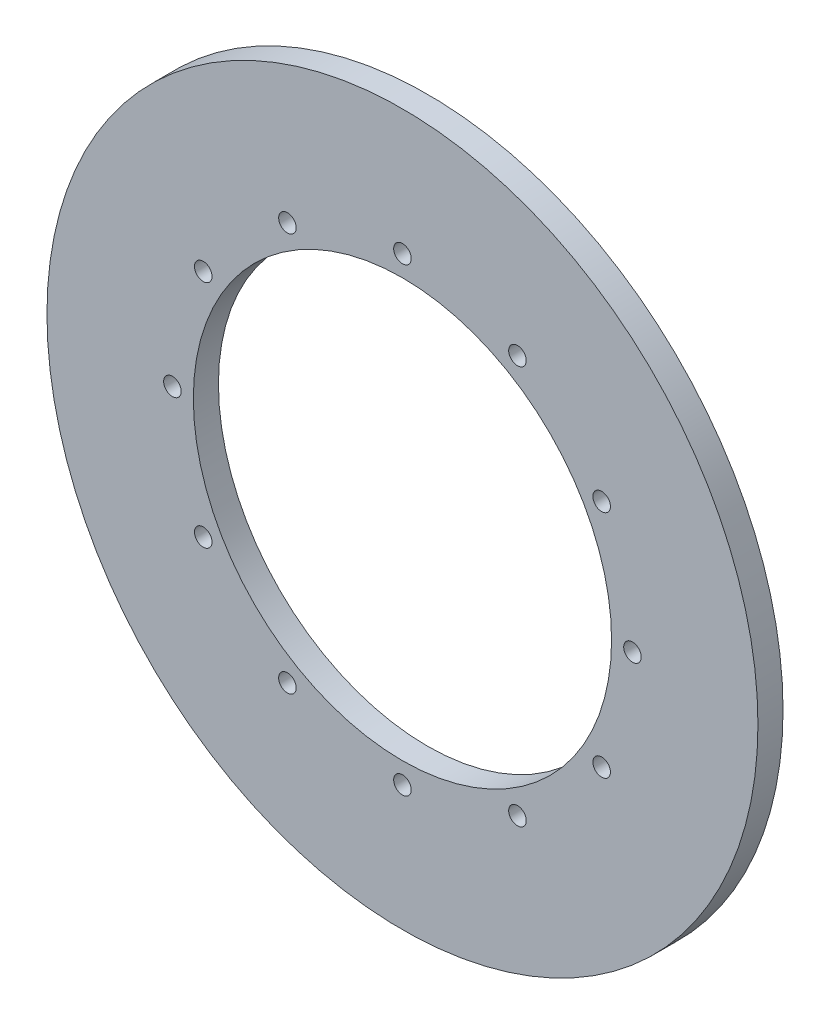
ISO-10303-21;
HEADER;
FILE_DESCRIPTION(('STEP AP214'),'2;1');
FILE_NAME('part.step','',(''),(''),'','','');
FILE_SCHEMA(('AUTOMOTIVE_DESIGN { 1 0 10303 214 1 1 1 1 }'));
ENDSEC;
DATA;
#1=APPLICATION_CONTEXT('core data for automotive mechanical design processes');
#2=APPLICATION_PROTOCOL_DEFINITION('international standard','automotive_design',2000,#1);
#3=PRODUCT_CONTEXT('',#1,'mechanical');
#4=PRODUCT('Part','Part','',(#3));
#5=PRODUCT_RELATED_PRODUCT_CATEGORY('part','',(#4));
#6=PRODUCT_DEFINITION_FORMATION('','',#4);
#7=PRODUCT_DEFINITION_CONTEXT('part definition',#1,'design');
#8=PRODUCT_DEFINITION('design','',#6,#7);
#9=PRODUCT_DEFINITION_SHAPE('','',#8);
#10=(LENGTH_UNIT() NAMED_UNIT(*) SI_UNIT(.MILLI.,.METRE.));
#11=(NAMED_UNIT(*) PLANE_ANGLE_UNIT() SI_UNIT($,.RADIAN.));
#12=(NAMED_UNIT(*) SI_UNIT($,.STERADIAN.) SOLID_ANGLE_UNIT());
#13=UNCERTAINTY_MEASURE_WITH_UNIT(LENGTH_MEASURE(1.E-05),#10,'distance_accuracy_value','');
#14=(GEOMETRIC_REPRESENTATION_CONTEXT(3) GLOBAL_UNCERTAINTY_ASSIGNED_CONTEXT((#13)) GLOBAL_UNIT_ASSIGNED_CONTEXT((#10,
#11,#12)) REPRESENTATION_CONTEXT('',''));
#15=CARTESIAN_POINT('',(0.,0.,0.));
#16=DIRECTION('',(0.,0.,1.));
#17=DIRECTION('',(1.,0.,0.));
#18=AXIS2_PLACEMENT_3D('',#15,#16,#17);
#19=CARTESIAN_POINT('',(-47.631397208143,27.4999999999979,3.));
#20=DIRECTION('',(0.,0.,-1.));
#21=DIRECTION('',(-1.,0.,0.));
#22=AXIS2_PLACEMENT_3D('',#19,#20,#21);
#23=CYLINDRICAL_SURFACE('',#22,2.10000000000236);
#24=CARTESIAN_POINT('',(-47.631397208143,27.4999999999979,3.));
#25=DIRECTION('',(0.,0.,-1.));
#26=DIRECTION('',(-1.,0.,0.));
#27=AXIS2_PLACEMENT_3D('',#24,#25,#26);
#28=CIRCLE('',#27,2.10000000000236);
#29=CARTESIAN_POINT('',(-49.7313972081453,27.4999999999979,3.));
#30=VERTEX_POINT('',#29);
#31=EDGE_CURVE('E38',#30,#30,#28,.T.);
#32=ORIENTED_EDGE('',*,*,#31,.F.);
#33=EDGE_LOOP('',(#32));
#34=FACE_BOUND('',#33,.T.);
#35=CARTESIAN_POINT('',(-47.631397208143,27.4999999999979,-3.));
#36=DIRECTION('',(0.,0.,-1.));
#37=DIRECTION('',(-1.,0.,0.));
#38=AXIS2_PLACEMENT_3D('',#35,#36,#37);
#39=CIRCLE('',#38,2.10000000000236);
#40=CARTESIAN_POINT('',(-49.7313972081453,27.4999999999979,-3.));
#41=VERTEX_POINT('',#40);
#42=EDGE_CURVE('E111',#41,#41,#39,.T.);
#43=ORIENTED_EDGE('',*,*,#42,.T.);
#44=EDGE_LOOP('',(#43));
#45=FACE_BOUND('',#44,.T.);
#46=ADVANCED_FACE('F35',(#34,#45),#23,.F.);
#47=CARTESIAN_POINT('',(-47.6313972081406,-27.500000000002,3.));
#48=DIRECTION('',(0.,0.,-1.));
#49=DIRECTION('',(-1.,0.,0.));
#50=AXIS2_PLACEMENT_3D('',#47,#48,#49);
#51=CYLINDRICAL_SURFACE('',#50,2.10000000000444);
#52=CARTESIAN_POINT('',(-47.6313972081406,-27.500000000002,3.));
#53=DIRECTION('',(0.,0.,-1.));
#54=DIRECTION('',(-1.,0.,0.));
#55=AXIS2_PLACEMENT_3D('',#52,#53,#54);
#56=CIRCLE('',#55,2.10000000000444);
#57=CARTESIAN_POINT('',(-49.7313972081451,-27.500000000002,3.));
#58=VERTEX_POINT('',#57);
#59=EDGE_CURVE('E95',#58,#58,#56,.T.);
#60=ORIENTED_EDGE('',*,*,#59,.F.);
#61=EDGE_LOOP('',(#60));
#62=FACE_BOUND('',#61,.T.);
#63=CARTESIAN_POINT('',(-47.6313972081406,-27.500000000002,-3.));
#64=DIRECTION('',(0.,0.,-1.));
#65=DIRECTION('',(-1.,0.,0.));
#66=AXIS2_PLACEMENT_3D('',#63,#64,#65);
#67=CIRCLE('',#66,2.10000000000444);
#68=CARTESIAN_POINT('',(-49.7313972081451,-27.500000000002,-3.));
#69=VERTEX_POINT('',#68);
#70=EDGE_CURVE('E120',#69,#69,#67,.T.);
#71=ORIENTED_EDGE('',*,*,#70,.T.);
#72=EDGE_LOOP('',(#71));
#73=FACE_BOUND('',#72,.T.);
#74=ADVANCED_FACE('F166',(#62,#73),#51,.F.);
#75=CARTESIAN_POINT('',(4.66937538383073E-12,-55.,3.));
#76=DIRECTION('',(0.,0.,-1.));
#77=DIRECTION('',(-1.,0.,0.));
#78=AXIS2_PLACEMENT_3D('',#75,#76,#77);
#79=CYLINDRICAL_SURFACE('',#78,2.10000000000483);
#80=CARTESIAN_POINT('',(4.66937538383073E-12,-55.,3.));
#81=DIRECTION('',(0.,0.,-1.));
#82=DIRECTION('',(-1.,0.,0.));
#83=AXIS2_PLACEMENT_3D('',#80,#81,#82);
#84=CIRCLE('',#83,2.10000000000483);
#85=CARTESIAN_POINT('',(-2.10000000000016,-55.,3.));
#86=VERTEX_POINT('',#85);
#87=EDGE_CURVE('E92',#86,#86,#84,.T.);
#88=ORIENTED_EDGE('',*,*,#87,.F.);
#89=EDGE_LOOP('',(#88));
#90=FACE_BOUND('',#89,.T.);
#91=CARTESIAN_POINT('',(4.66937538383073E-12,-55.,-3.));
#92=DIRECTION('',(0.,0.,-1.));
#93=DIRECTION('',(-1.,0.,0.));
#94=AXIS2_PLACEMENT_3D('',#91,#92,#93);
#95=CIRCLE('',#94,2.10000000000483);
#96=CARTESIAN_POINT('',(-2.10000000000016,-55.,-3.));
#97=VERTEX_POINT('',#96);
#98=EDGE_CURVE('E126',#97,#97,#95,.T.);
#99=ORIENTED_EDGE('',*,*,#98,.T.);
#100=EDGE_LOOP('',(#99));
#101=FACE_BOUND('',#100,.T.);
#102=ADVANCED_FACE('F171',(#90,#101),#79,.F.);
#103=CARTESIAN_POINT('',(47.6313972081476,-27.499999999998,3.));
#104=DIRECTION('',(0.,0.,-1.));
#105=DIRECTION('',(-1.,0.,0.));
#106=AXIS2_PLACEMENT_3D('',#103,#104,#105);
#107=CYLINDRICAL_SURFACE('',#106,2.10000000000301);
#108=CARTESIAN_POINT('',(47.6313972081476,-27.499999999998,3.));
#109=DIRECTION('',(0.,0.,-1.));
#110=DIRECTION('',(-1.,0.,0.));
#111=AXIS2_PLACEMENT_3D('',#108,#109,#110);
#112=CIRCLE('',#111,2.10000000000301);
#113=CARTESIAN_POINT('',(45.5313972081446,-27.499999999998,3.));
#114=VERTEX_POINT('',#113);
#115=EDGE_CURVE('E88',#114,#114,#112,.T.);
#116=ORIENTED_EDGE('',*,*,#115,.F.);
#117=EDGE_LOOP('',(#116));
#118=FACE_BOUND('',#117,.T.);
#119=CARTESIAN_POINT('',(47.6313972081476,-27.499999999998,-3.));
#120=DIRECTION('',(0.,0.,-1.));
#121=DIRECTION('',(-1.,0.,0.));
#122=AXIS2_PLACEMENT_3D('',#119,#120,#121);
#123=CIRCLE('',#122,2.10000000000301);
#124=CARTESIAN_POINT('',(45.5313972081446,-27.499999999998,-3.));
#125=VERTEX_POINT('',#124);
#126=EDGE_CURVE('E132',#125,#125,#123,.T.);
#127=ORIENTED_EDGE('',*,*,#126,.T.);
#128=EDGE_LOOP('',(#127));
#129=FACE_BOUND('',#128,.T.);
#130=ADVANCED_FACE('F216',(#118,#129),#107,.F.);
#131=CARTESIAN_POINT('',(47.6313972081453,27.500000000002,3.));
#132=DIRECTION('',(0.,0.,-1.));
#133=DIRECTION('',(-1.,0.,0.));
#134=AXIS2_PLACEMENT_3D('',#131,#132,#133);
#135=CYLINDRICAL_SURFACE('',#134,2.10000000000064);
#136=CARTESIAN_POINT('',(47.6313972081453,27.500000000002,3.));
#137=DIRECTION('',(0.,0.,-1.));
#138=DIRECTION('',(-1.,0.,0.));
#139=AXIS2_PLACEMENT_3D('',#136,#137,#138);
#140=CIRCLE('',#139,2.10000000000064);
#141=CARTESIAN_POINT('',(45.5313972081447,27.500000000002,3.));
#142=VERTEX_POINT('',#141);
#143=EDGE_CURVE('E84',#142,#142,#140,.T.);
#144=ORIENTED_EDGE('',*,*,#143,.F.);
#145=EDGE_LOOP('',(#144));
#146=FACE_BOUND('',#145,.T.);
#147=CARTESIAN_POINT('',(47.6313972081453,27.500000000002,-3.));
#148=DIRECTION('',(0.,0.,-1.));
#149=DIRECTION('',(-1.,0.,0.));
#150=AXIS2_PLACEMENT_3D('',#147,#148,#149);
#151=CIRCLE('',#150,2.10000000000064);
#152=CARTESIAN_POINT('',(45.5313972081447,27.500000000002,-3.));
#153=VERTEX_POINT('',#152);
#154=EDGE_CURVE('E138',#153,#153,#151,.T.);
#155=ORIENTED_EDGE('',*,*,#154,.T.);
#156=EDGE_LOOP('',(#155));
#157=FACE_BOUND('',#156,.T.);
#158=ADVANCED_FACE('F212',(#146,#157),#135,.F.);
#159=CARTESIAN_POINT('',(0.,55.,3.));
#160=DIRECTION('',(0.,0.,-1.));
#161=DIRECTION('',(-1.,0.,0.));
#162=AXIS2_PLACEMENT_3D('',#159,#160,#161);
#163=CYLINDRICAL_SURFACE('',#162,2.1);
#164=CARTESIAN_POINT('',(0.,55.,3.));
#165=DIRECTION('',(0.,0.,-1.));
#166=DIRECTION('',(-1.,0.,0.));
#167=AXIS2_PLACEMENT_3D('',#164,#165,#166);
#168=CIRCLE('',#167,2.1);
#169=CARTESIAN_POINT('',(-2.1,55.,3.));
#170=VERTEX_POINT('',#169);
#171=EDGE_CURVE('E80',#170,#170,#168,.T.);
#172=ORIENTED_EDGE('',*,*,#171,.F.);
#173=EDGE_LOOP('',(#172));
#174=FACE_BOUND('',#173,.T.);
#175=CARTESIAN_POINT('',(0.,55.,-3.));
#176=DIRECTION('',(0.,0.,-1.));
#177=DIRECTION('',(-1.,0.,0.));
#178=AXIS2_PLACEMENT_3D('',#175,#176,#177);
#179=CIRCLE('',#178,2.1);
#180=CARTESIAN_POINT('',(-2.1,55.,-3.));
#181=VERTEX_POINT('',#180);
#182=EDGE_CURVE('E144',#181,#181,#179,.T.);
#183=ORIENTED_EDGE('',*,*,#182,.T.);
#184=EDGE_LOOP('',(#183));
#185=FACE_BOUND('',#184,.T.);
#186=ADVANCED_FACE('F208',(#174,#185),#163,.F.);
#187=CARTESIAN_POINT('',(0.,0.,3.));
#188=DIRECTION('',(0.,0.,-1.));
#189=DIRECTION('',(-1.,0.,0.));
#190=AXIS2_PLACEMENT_3D('',#187,#188,#189);
#191=CYLINDRICAL_SURFACE('',#190,85.);
#192=CARTESIAN_POINT('',(0.,0.,3.));
#193=DIRECTION('',(0.,0.,-1.));
#194=DIRECTION('',(-1.,0.,0.));
#195=AXIS2_PLACEMENT_3D('',#192,#193,#194);
#196=CIRCLE('',#195,85.);
#197=CARTESIAN_POINT('',(-85.,0.,3.));
#198=VERTEX_POINT('',#197);
#199=EDGE_CURVE('E76',#198,#198,#196,.F.);
#200=ORIENTED_EDGE('',*,*,#199,.F.);
#201=EDGE_LOOP('',(#200));
#202=FACE_BOUND('',#201,.T.);
#203=CARTESIAN_POINT('',(0.,0.,-3.));
#204=DIRECTION('',(0.,0.,-1.));
#205=DIRECTION('',(-1.,0.,0.));
#206=AXIS2_PLACEMENT_3D('',#203,#204,#205);
#207=CIRCLE('',#206,85.);
#208=CARTESIAN_POINT('',(-85.,0.,-3.));
#209=VERTEX_POINT('',#208);
#210=EDGE_CURVE('E54',#209,#209,#207,.T.);
#211=ORIENTED_EDGE('',*,*,#210,.F.);
#212=EDGE_LOOP('',(#211));
#213=FACE_BOUND('',#212,.T.);
#214=ADVANCED_FACE('F200',(#202,#213),#191,.T.);
#215=CARTESIAN_POINT('',(0.,0.,3.));
#216=DIRECTION('',(0.,0.,-1.));
#217=DIRECTION('',(-1.,0.,0.));
#218=AXIS2_PLACEMENT_3D('',#215,#216,#217);
#219=CYLINDRICAL_SURFACE('',#218,50.);
#220=CARTESIAN_POINT('',(0.,0.,3.));
#221=DIRECTION('',(0.,0.,-1.));
#222=DIRECTION('',(-1.,0.,0.));
#223=AXIS2_PLACEMENT_3D('',#220,#221,#222);
#224=CIRCLE('',#223,50.);
#225=CARTESIAN_POINT('',(-50.,0.,3.));
#226=VERTEX_POINT('',#225);
#227=EDGE_CURVE('E72',#226,#226,#224,.T.);
#228=ORIENTED_EDGE('',*,*,#227,.F.);
#229=EDGE_LOOP('',(#228));
#230=FACE_BOUND('',#229,.T.);
#231=CARTESIAN_POINT('',(0.,0.,-3.));
#232=DIRECTION('',(0.,0.,-1.));
#233=DIRECTION('',(-1.,0.,0.));
#234=AXIS2_PLACEMENT_3D('',#231,#232,#233);
#235=CIRCLE('',#234,50.);
#236=CARTESIAN_POINT('',(-50.,0.,-3.));
#237=VERTEX_POINT('',#236);
#238=EDGE_CURVE('E147',#237,#237,#235,.T.);
#239=ORIENTED_EDGE('',*,*,#238,.T.);
#240=EDGE_LOOP('',(#239));
#241=FACE_BOUND('',#240,.T.);
#242=ADVANCED_FACE('F151',(#230,#241),#219,.F.);
#243=CARTESIAN_POINT('',(27.5000000000001,47.6313972081441,3.));
#244=DIRECTION('',(0.,0.,-1.));
#245=DIRECTION('',(-1.,0.,0.));
#246=AXIS2_PLACEMENT_3D('',#243,#244,#245);
#247=CYLINDRICAL_SURFACE('',#246,2.1);
#248=CARTESIAN_POINT('',(27.5000000000001,47.6313972081441,3.));
#249=DIRECTION('',(0.,0.,-1.));
#250=DIRECTION('',(-1.,0.,0.));
#251=AXIS2_PLACEMENT_3D('',#248,#249,#250);
#252=CIRCLE('',#251,2.1);
#253=CARTESIAN_POINT('',(25.4000000000001,47.6313972081441,3.));
#254=VERTEX_POINT('',#253);
#255=EDGE_CURVE('E68',#254,#254,#252,.T.);
#256=ORIENTED_EDGE('',*,*,#255,.F.);
#257=EDGE_LOOP('',(#256));
#258=FACE_BOUND('',#257,.T.);
#259=CARTESIAN_POINT('',(27.5000000000001,47.6313972081441,-3.));
#260=DIRECTION('',(0.,0.,-1.));
#261=DIRECTION('',(-1.,0.,0.));
#262=AXIS2_PLACEMENT_3D('',#259,#260,#261);
#263=CIRCLE('',#262,2.1);
#264=CARTESIAN_POINT('',(25.4000000000001,47.6313972081441,-3.));
#265=VERTEX_POINT('',#264);
#266=EDGE_CURVE('E141',#265,#265,#263,.T.);
#267=ORIENTED_EDGE('',*,*,#266,.T.);
#268=EDGE_LOOP('',(#267));
#269=FACE_BOUND('',#268,.T.);
#270=ADVANCED_FACE('F188',(#258,#269),#247,.F.);
#271=CARTESIAN_POINT('',(55.0000000000023,2.33468769191537E-12,3.));
#272=DIRECTION('',(0.,0.,-1.));
#273=DIRECTION('',(-1.,0.,0.));
#274=AXIS2_PLACEMENT_3D('',#271,#272,#273);
#275=CYLINDRICAL_SURFACE('',#274,2.10000000000173);
#276=CARTESIAN_POINT('',(55.0000000000023,2.33468769191537E-12,3.));
#277=DIRECTION('',(0.,0.,-1.));
#278=DIRECTION('',(-1.,0.,0.));
#279=AXIS2_PLACEMENT_3D('',#276,#277,#278);
#280=CIRCLE('',#279,2.10000000000173);
#281=CARTESIAN_POINT('',(52.9000000000006,2.33468769191537E-12,3.));
#282=VERTEX_POINT('',#281);
#283=EDGE_CURVE('E64',#282,#282,#280,.T.);
#284=ORIENTED_EDGE('',*,*,#283,.F.);
#285=EDGE_LOOP('',(#284));
#286=FACE_BOUND('',#285,.T.);
#287=CARTESIAN_POINT('',(55.0000000000023,2.33468769191537E-12,-3.));
#288=DIRECTION('',(0.,0.,-1.));
#289=DIRECTION('',(-1.,0.,0.));
#290=AXIS2_PLACEMENT_3D('',#287,#288,#289);
#291=CIRCLE('',#290,2.10000000000173);
#292=CARTESIAN_POINT('',(52.9000000000006,2.33468769191537E-12,-3.));
#293=VERTEX_POINT('',#292);
#294=EDGE_CURVE('E135',#293,#293,#291,.T.);
#295=ORIENTED_EDGE('',*,*,#294,.T.);
#296=EDGE_LOOP('',(#295));
#297=FACE_BOUND('',#296,.T.);
#298=ADVANCED_FACE('F190',(#286,#297),#275,.F.);
#299=CARTESIAN_POINT('',(27.5000000000044,-47.6313972081429,3.));
#300=DIRECTION('',(0.,0.,-1.));
#301=DIRECTION('',(-1.,0.,0.));
#302=AXIS2_PLACEMENT_3D('',#299,#300,#301);
#303=CYLINDRICAL_SURFACE('',#302,2.10000000000414);
#304=CARTESIAN_POINT('',(27.5000000000044,-47.6313972081429,3.));
#305=DIRECTION('',(0.,0.,-1.));
#306=DIRECTION('',(-1.,0.,0.));
#307=AXIS2_PLACEMENT_3D('',#304,#305,#306);
#308=CIRCLE('',#307,2.10000000000414);
#309=CARTESIAN_POINT('',(25.4000000000002,-47.6313972081429,3.));
#310=VERTEX_POINT('',#309);
#311=EDGE_CURVE('E60',#310,#310,#308,.T.);
#312=ORIENTED_EDGE('',*,*,#311,.F.);
#313=EDGE_LOOP('',(#312));
#314=FACE_BOUND('',#313,.T.);
#315=CARTESIAN_POINT('',(27.5000000000044,-47.6313972081429,-3.));
#316=DIRECTION('',(0.,0.,-1.));
#317=DIRECTION('',(-1.,0.,0.));
#318=AXIS2_PLACEMENT_3D('',#315,#316,#317);
#319=CIRCLE('',#318,2.10000000000414);
#320=CARTESIAN_POINT('',(25.4000000000002,-47.6313972081429,-3.));
#321=VERTEX_POINT('',#320);
#322=EDGE_CURVE('E129',#321,#321,#319,.T.);
#323=ORIENTED_EDGE('',*,*,#322,.T.);
#324=EDGE_LOOP('',(#323));
#325=FACE_BOUND('',#324,.T.);
#326=ADVANCED_FACE('F197',(#314,#325),#303,.F.);
#327=CARTESIAN_POINT('',(-27.4999999999956,-47.6313972081453,3.));
#328=DIRECTION('',(0.,0.,-1.));
#329=DIRECTION('',(-1.,0.,0.));
#330=AXIS2_PLACEMENT_3D('',#327,#328,#329);
#331=CYLINDRICAL_SURFACE('',#330,2.10000000000495);
#332=CARTESIAN_POINT('',(-27.4999999999956,-47.6313972081453,3.));
#333=DIRECTION('',(0.,0.,-1.));
#334=DIRECTION('',(-1.,0.,0.));
#335=AXIS2_PLACEMENT_3D('',#332,#333,#334);
#336=CIRCLE('',#335,2.10000000000495);
#337=CARTESIAN_POINT('',(-29.6000000000006,-47.6313972081453,3.));
#338=VERTEX_POINT('',#337);
#339=EDGE_CURVE('E51',#338,#338,#336,.T.);
#340=ORIENTED_EDGE('',*,*,#339,.F.);
#341=EDGE_LOOP('',(#340));
#342=FACE_BOUND('',#341,.T.);
#343=CARTESIAN_POINT('',(-27.4999999999956,-47.6313972081453,-3.));
#344=DIRECTION('',(0.,0.,-1.));
#345=DIRECTION('',(-1.,0.,0.));
#346=AXIS2_PLACEMENT_3D('',#343,#344,#345);
#347=CIRCLE('',#346,2.10000000000495);
#348=CARTESIAN_POINT('',(-29.6000000000006,-47.6313972081453,-3.));
#349=VERTEX_POINT('',#348);
#350=EDGE_CURVE('E123',#349,#349,#347,.T.);
#351=ORIENTED_EDGE('',*,*,#350,.T.);
#352=EDGE_LOOP('',(#351));
#353=FACE_BOUND('',#352,.T.);
#354=ADVANCED_FACE('F277',(#342,#353),#331,.F.);
#355=CARTESIAN_POINT('',(-54.9999999999977,-2.34142324931068E-12,3.));
#356=DIRECTION('',(0.,0.,-1.));
#357=DIRECTION('',(-1.,0.,0.));
#358=AXIS2_PLACEMENT_3D('',#355,#356,#357);
#359=CYLINDRICAL_SURFACE('',#358,2.10000000000347);
#360=CARTESIAN_POINT('',(-54.9999999999977,-2.34142324931068E-12,3.));
#361=DIRECTION('',(0.,0.,-1.));
#362=DIRECTION('',(-1.,0.,0.));
#363=AXIS2_PLACEMENT_3D('',#360,#361,#362);
#364=CIRCLE('',#363,2.10000000000347);
#365=CARTESIAN_POINT('',(-57.1000000000011,-2.34142324931068E-12,3.));
#366=VERTEX_POINT('',#365);
#367=EDGE_CURVE('E43',#366,#366,#364,.T.);
#368=ORIENTED_EDGE('',*,*,#367,.F.);
#369=EDGE_LOOP('',(#368));
#370=FACE_BOUND('',#369,.T.);
#371=CARTESIAN_POINT('',(-54.9999999999977,-2.34142324931068E-12,-3.));
#372=DIRECTION('',(0.,0.,-1.));
#373=DIRECTION('',(-1.,0.,0.));
#374=AXIS2_PLACEMENT_3D('',#371,#372,#373);
#375=CIRCLE('',#374,2.10000000000347);
#376=CARTESIAN_POINT('',(-57.1000000000011,-2.34142324931068E-12,-3.));
#377=VERTEX_POINT('',#376);
#378=EDGE_CURVE('E115',#377,#377,#375,.T.);
#379=ORIENTED_EDGE('',*,*,#378,.T.);
#380=EDGE_LOOP('',(#379));
#381=FACE_BOUND('',#380,.T.);
#382=ADVANCED_FACE('F287',(#370,#381),#359,.F.);
#383=CARTESIAN_POINT('',(-27.4999999999994,47.6313972081445,3.));
#384=DIRECTION('',(0.,0.,-1.));
#385=DIRECTION('',(-1.,0.,0.));
#386=AXIS2_PLACEMENT_3D('',#383,#384,#385);
#387=CYLINDRICAL_SURFACE('',#386,2.1);
#388=CARTESIAN_POINT('',(-27.4999999999994,47.6313972081445,3.));
#389=DIRECTION('',(0.,0.,-1.));
#390=DIRECTION('',(-1.,0.,0.));
#391=AXIS2_PLACEMENT_3D('',#388,#389,#390);
#392=CIRCLE('',#391,2.1);
#393=CARTESIAN_POINT('',(-29.5999999999994,47.6313972081445,3.));
#394=VERTEX_POINT('',#393);
#395=EDGE_CURVE('E10',#394,#394,#392,.T.);
#396=ORIENTED_EDGE('',*,*,#395,.F.);
#397=EDGE_LOOP('',(#396));
#398=FACE_BOUND('',#397,.T.);
#399=CARTESIAN_POINT('',(-27.4999999999994,47.6313972081445,-3.));
#400=DIRECTION('',(0.,0.,-1.));
#401=DIRECTION('',(-1.,0.,0.));
#402=AXIS2_PLACEMENT_3D('',#399,#400,#401);
#403=CIRCLE('',#402,2.1);
#404=CARTESIAN_POINT('',(-29.5999999999994,47.6313972081445,-3.));
#405=VERTEX_POINT('',#404);
#406=EDGE_CURVE('E107',#405,#405,#403,.T.);
#407=ORIENTED_EDGE('',*,*,#406,.T.);
#408=EDGE_LOOP('',(#407));
#409=FACE_BOUND('',#408,.T.);
#410=ADVANCED_FACE('F161',(#398,#409),#387,.F.);
#411=CARTESIAN_POINT('',(0.,0.,3.));
#412=DIRECTION('',(0.,0.,1.));
#413=DIRECTION('',(1.,0.,0.));
#414=AXIS2_PLACEMENT_3D('',#411,#412,#413);
#415=PLANE('',#414);
#416=ORIENTED_EDGE('',*,*,#395,.T.);
#417=EDGE_LOOP('',(#416));
#418=FACE_BOUND('',#417,.T.);
#419=ORIENTED_EDGE('',*,*,#367,.T.);
#420=EDGE_LOOP('',(#419));
#421=FACE_BOUND('',#420,.T.);
#422=ORIENTED_EDGE('',*,*,#339,.T.);
#423=EDGE_LOOP('',(#422));
#424=FACE_BOUND('',#423,.T.);
#425=ORIENTED_EDGE('',*,*,#311,.T.);
#426=EDGE_LOOP('',(#425));
#427=FACE_BOUND('',#426,.T.);
#428=ORIENTED_EDGE('',*,*,#283,.T.);
#429=EDGE_LOOP('',(#428));
#430=FACE_BOUND('',#429,.T.);
#431=ORIENTED_EDGE('',*,*,#255,.T.);
#432=EDGE_LOOP('',(#431));
#433=FACE_BOUND('',#432,.T.);
#434=ORIENTED_EDGE('',*,*,#227,.T.);
#435=EDGE_LOOP('',(#434));
#436=FACE_BOUND('',#435,.T.);
#437=ORIENTED_EDGE('',*,*,#199,.T.);
#438=EDGE_LOOP('',(#437));
#439=FACE_BOUND('',#438,.T.);
#440=ORIENTED_EDGE('',*,*,#171,.T.);
#441=EDGE_LOOP('',(#440));
#442=FACE_BOUND('',#441,.T.);
#443=ORIENTED_EDGE('',*,*,#143,.T.);
#444=EDGE_LOOP('',(#443));
#445=FACE_BOUND('',#444,.T.);
#446=ORIENTED_EDGE('',*,*,#115,.T.);
#447=EDGE_LOOP('',(#446));
#448=FACE_BOUND('',#447,.T.);
#449=ORIENTED_EDGE('',*,*,#87,.T.);
#450=EDGE_LOOP('',(#449));
#451=FACE_BOUND('',#450,.T.);
#452=ORIENTED_EDGE('',*,*,#59,.T.);
#453=EDGE_LOOP('',(#452));
#454=FACE_BOUND('',#453,.T.);
#455=ORIENTED_EDGE('',*,*,#31,.T.);
#456=EDGE_LOOP('',(#455));
#457=FACE_BOUND('',#456,.T.);
#458=ADVANCED_FACE('F155',(#418,#421,#424,#427,#430,#433,#436,#439,#442,#445,#448,#451,#454,
#457),#415,.T.);
#459=CARTESIAN_POINT('',(0.,0.,-3.));
#460=DIRECTION('',(0.,0.,-1.));
#461=DIRECTION('',(-1.,0.,0.));
#462=AXIS2_PLACEMENT_3D('',#459,#460,#461);
#463=PLANE('',#462);
#464=ORIENTED_EDGE('',*,*,#182,.F.);
#465=EDGE_LOOP('',(#464));
#466=FACE_BOUND('',#465,.T.);
#467=ORIENTED_EDGE('',*,*,#154,.F.);
#468=EDGE_LOOP('',(#467));
#469=FACE_BOUND('',#468,.T.);
#470=ORIENTED_EDGE('',*,*,#126,.F.);
#471=EDGE_LOOP('',(#470));
#472=FACE_BOUND('',#471,.T.);
#473=ORIENTED_EDGE('',*,*,#98,.F.);
#474=EDGE_LOOP('',(#473));
#475=FACE_BOUND('',#474,.T.);
#476=ORIENTED_EDGE('',*,*,#70,.F.);
#477=EDGE_LOOP('',(#476));
#478=FACE_BOUND('',#477,.T.);
#479=ORIENTED_EDGE('',*,*,#42,.F.);
#480=EDGE_LOOP('',(#479));
#481=FACE_BOUND('',#480,.T.);
#482=ORIENTED_EDGE('',*,*,#210,.T.);
#483=EDGE_LOOP('',(#482));
#484=FACE_BOUND('',#483,.T.);
#485=ORIENTED_EDGE('',*,*,#406,.F.);
#486=EDGE_LOOP('',(#485));
#487=FACE_BOUND('',#486,.T.);
#488=ORIENTED_EDGE('',*,*,#378,.F.);
#489=EDGE_LOOP('',(#488));
#490=FACE_BOUND('',#489,.T.);
#491=ORIENTED_EDGE('',*,*,#350,.F.);
#492=EDGE_LOOP('',(#491));
#493=FACE_BOUND('',#492,.T.);
#494=ORIENTED_EDGE('',*,*,#322,.F.);
#495=EDGE_LOOP('',(#494));
#496=FACE_BOUND('',#495,.T.);
#497=ORIENTED_EDGE('',*,*,#294,.F.);
#498=EDGE_LOOP('',(#497));
#499=FACE_BOUND('',#498,.T.);
#500=ORIENTED_EDGE('',*,*,#266,.F.);
#501=EDGE_LOOP('',(#500));
#502=FACE_BOUND('',#501,.T.);
#503=ORIENTED_EDGE('',*,*,#238,.F.);
#504=EDGE_LOOP('',(#503));
#505=FACE_BOUND('',#504,.T.);
#506=ADVANCED_FACE('F153',(#466,#469,#472,#475,#478,#481,#484,#487,#490,#493,#496,#499,#502,
#505),#463,.T.);
#507=CLOSED_SHELL('',(#46,#74,#102,#130,#158,#186,#214,#242,#270,#298,#326,#354,#382,#410,#458,#506));
#508=MANIFOLD_SOLID_BREP('B2',#507);
#509=ADVANCED_BREP_SHAPE_REPRESENTATION('',(#18,#508),#14);
#510=SHAPE_DEFINITION_REPRESENTATION(#9,#509);
ENDSEC;
END-ISO-10303-21;
